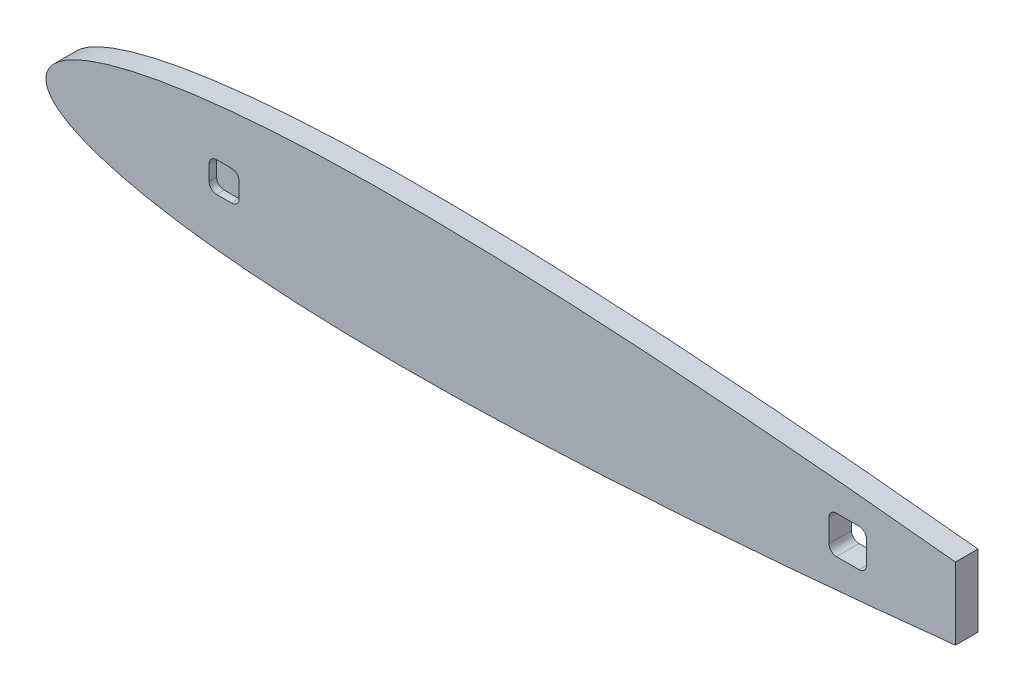
ISO-10303-21;
HEADER;
FILE_DESCRIPTION(('STEP AP214'),'2;1');
FILE_NAME('part.step','',(''),(''),'','','');
FILE_SCHEMA(('AUTOMOTIVE_DESIGN { 1 0 10303 214 1 1 1 1 }'));
ENDSEC;
DATA;
#1=APPLICATION_CONTEXT('core data for automotive mechanical design processes');
#2=APPLICATION_PROTOCOL_DEFINITION('international standard','automotive_design',2000,#1);
#3=PRODUCT_CONTEXT('',#1,'mechanical');
#4=PRODUCT('Part','Part','',(#3));
#5=PRODUCT_RELATED_PRODUCT_CATEGORY('part','',(#4));
#6=PRODUCT_DEFINITION_FORMATION('','',#4);
#7=PRODUCT_DEFINITION_CONTEXT('part definition',#1,'design');
#8=PRODUCT_DEFINITION('design','',#6,#7);
#9=PRODUCT_DEFINITION_SHAPE('','',#8);
#10=(LENGTH_UNIT() NAMED_UNIT(*) SI_UNIT(.MILLI.,.METRE.));
#11=(NAMED_UNIT(*) PLANE_ANGLE_UNIT() SI_UNIT($,.RADIAN.));
#12=(NAMED_UNIT(*) SI_UNIT($,.STERADIAN.) SOLID_ANGLE_UNIT());
#13=UNCERTAINTY_MEASURE_WITH_UNIT(LENGTH_MEASURE(1.E-05),#10,'distance_accuracy_value','');
#14=(GEOMETRIC_REPRESENTATION_CONTEXT(3) GLOBAL_UNCERTAINTY_ASSIGNED_CONTEXT((#13)) GLOBAL_UNIT_ASSIGNED_CONTEXT((#10,
#11,#12)) REPRESENTATION_CONTEXT('',''));
#15=CARTESIAN_POINT('',(0.,0.,0.));
#16=DIRECTION('',(0.,0.,1.));
#17=DIRECTION('',(1.,0.,0.));
#18=AXIS2_PLACEMENT_3D('',#15,#16,#17);
#19=CARTESIAN_POINT('',(241.999999999784,3.15208797082437E-12,6.));
#20=DIRECTION('',(1.,0.,0.));
#21=DIRECTION('',(0.,1.,0.));
#22=AXIS2_PLACEMENT_3D('',#19,#20,#21);
#23=PLANE('',#22);
#24=DIRECTION('',(0.,-1.,0.));
#25=VECTOR('',#24,1.);
#26=CARTESIAN_POINT('',(241.999999999784,3.15208797082437E-12,0.));
#27=LINE('',#26,#25);
#28=CARTESIAN_POINT('',(241.999999999784,9.58914285551744,0.));
#29=VERTEX_POINT('',#28);
#30=CARTESIAN_POINT('',(241.999999999784,-9.58914285551742,0.));
#31=VERTEX_POINT('',#30);
#32=EDGE_CURVE('E158',#29,#31,#27,.T.);
#33=ORIENTED_EDGE('',*,*,#32,.F.);
#34=DIRECTION('',(0.,0.,-1.));
#35=VECTOR('',#34,1.);
#36=CARTESIAN_POINT('',(241.999999999784,9.58914285551744,6.));
#37=LINE('',#36,#35);
#38=CARTESIAN_POINT('',(241.999999999784,9.58914285551744,6.));
#39=VERTEX_POINT('',#38);
#40=EDGE_CURVE('E11',#39,#29,#37,.T.);
#41=ORIENTED_EDGE('',*,*,#40,.F.);
#42=DIRECTION('',(0.,-1.,0.));
#43=VECTOR('',#42,1.);
#44=CARTESIAN_POINT('',(241.999999999784,3.15208797082437E-12,6.));
#45=LINE('',#44,#43);
#46=CARTESIAN_POINT('',(241.999999999784,-9.58914285551742,6.));
#47=VERTEX_POINT('',#46);
#48=EDGE_CURVE('E142',#39,#47,#45,.T.);
#49=ORIENTED_EDGE('',*,*,#48,.T.);
#50=DIRECTION('',(0.,0.,-1.));
#51=VECTOR('',#50,1.);
#52=CARTESIAN_POINT('',(241.999999999784,-9.58914285551742,6.));
#53=LINE('',#52,#51);
#54=EDGE_CURVE('E44',#47,#31,#53,.T.);
#55=ORIENTED_EDGE('',*,*,#54,.T.);
#56=EDGE_LOOP('',(#33,#41,#49,#55));
#57=FACE_BOUND('',#56,.T.);
#58=ADVANCED_FACE('F35',(#57),#23,.T.);
#59=CARTESIAN_POINT('',(208.33333333,0.,6.));
#60=DIRECTION('',(-1.,0.,0.));
#61=DIRECTION('',(0.,0.,1.));
#62=AXIS2_PLACEMENT_3D('',#59,#60,#61);
#63=PLANE('',#62);
#64=DIRECTION('',(0.,1.,0.));
#65=VECTOR('',#64,1.);
#66=CARTESIAN_POINT('',(208.33333333,0.,0.));
#67=LINE('',#66,#65);
#68=CARTESIAN_POINT('',(208.33333333,-3.,0.));
#69=VERTEX_POINT('',#68);
#70=CARTESIAN_POINT('',(208.33333333,2.99999999999997,0.));
#71=VERTEX_POINT('',#70);
#72=EDGE_CURVE('E179',#69,#71,#67,.T.);
#73=ORIENTED_EDGE('',*,*,#72,.T.);
#74=DIRECTION('',(0.,0.,-1.));
#75=VECTOR('',#74,1.);
#76=CARTESIAN_POINT('',(208.33333333,2.99999999999997,6.));
#77=LINE('',#76,#75);
#78=CARTESIAN_POINT('',(208.33333333,2.99999999999997,6.));
#79=VERTEX_POINT('',#78);
#80=EDGE_CURVE('E39',#79,#71,#77,.T.);
#81=ORIENTED_EDGE('',*,*,#80,.F.);
#82=DIRECTION('',(0.,1.,0.));
#83=VECTOR('',#82,1.);
#84=CARTESIAN_POINT('',(208.33333333,0.,6.));
#85=LINE('',#84,#83);
#86=CARTESIAN_POINT('',(208.33333333,-3.,6.));
#87=VERTEX_POINT('',#86);
#88=EDGE_CURVE('E136',#87,#79,#85,.T.);
#89=ORIENTED_EDGE('',*,*,#88,.F.);
#90=DIRECTION('',(0.,0.,-1.));
#91=VECTOR('',#90,1.);
#92=CARTESIAN_POINT('',(208.33333333,-3.,6.));
#93=LINE('',#92,#91);
#94=EDGE_CURVE('E145',#87,#69,#93,.T.);
#95=ORIENTED_EDGE('',*,*,#94,.T.);
#96=EDGE_LOOP('',(#73,#81,#89,#95));
#97=FACE_BOUND('',#96,.T.);
#98=ADVANCED_FACE('F37',(#97),#63,.F.);
#99=CARTESIAN_POINT('',(210.33333333,2.99999999999999,6.));
#100=DIRECTION('',(0.,0.,-1.));
#101=DIRECTION('',(-1.,0.,0.));
#102=AXIS2_PLACEMENT_3D('',#99,#100,#101);
#103=CYLINDRICAL_SURFACE('',#102,2.);
#104=CARTESIAN_POINT('',(210.33333333,2.99999999999999,0.));
#105=DIRECTION('',(0.,0.,1.));
#106=DIRECTION('',(1.,0.,0.));
#107=AXIS2_PLACEMENT_3D('',#104,#105,#106);
#108=CIRCLE('',#107,2.);
#109=CARTESIAN_POINT('',(210.33333333,4.99999999999999,0.));
#110=VERTEX_POINT('',#109);
#111=EDGE_CURVE('E220',#71,#110,#108,.F.);
#112=ORIENTED_EDGE('',*,*,#111,.T.);
#113=DIRECTION('',(0.,0.,-1.));
#114=VECTOR('',#113,1.);
#115=CARTESIAN_POINT('',(210.33333333,4.99999999999999,6.));
#116=LINE('',#115,#114);
#117=CARTESIAN_POINT('',(210.33333333,4.99999999999999,6.));
#118=VERTEX_POINT('',#117);
#119=EDGE_CURVE('E222',#118,#110,#116,.T.);
#120=ORIENTED_EDGE('',*,*,#119,.F.);
#121=CARTESIAN_POINT('',(210.33333333,2.99999999999999,6.));
#122=DIRECTION('',(0.,0.,1.));
#123=DIRECTION('',(1.,0.,0.));
#124=AXIS2_PLACEMENT_3D('',#121,#122,#123);
#125=CIRCLE('',#124,2.);
#126=EDGE_CURVE('E107',#79,#118,#125,.F.);
#127=ORIENTED_EDGE('',*,*,#126,.F.);
#128=ORIENTED_EDGE('',*,*,#80,.T.);
#129=EDGE_LOOP('',(#112,#120,#127,#128));
#130=FACE_BOUND('',#129,.T.);
#131=ADVANCED_FACE('F214',(#130),#103,.F.);
#132=CARTESIAN_POINT('',(0.,4.99999999999999,6.));
#133=DIRECTION('',(0.,1.,0.));
#134=DIRECTION('',(0.,0.,1.));
#135=AXIS2_PLACEMENT_3D('',#132,#133,#134);
#136=PLANE('',#135);
#137=DIRECTION('',(1.,0.,0.));
#138=VECTOR('',#137,1.);
#139=CARTESIAN_POINT('',(0.,4.99999999999999,0.));
#140=LINE('',#139,#138);
#141=CARTESIAN_POINT('',(216.33333333,4.99999999999999,0.));
#142=VERTEX_POINT('',#141);
#143=EDGE_CURVE('E226',#110,#142,#140,.T.);
#144=ORIENTED_EDGE('',*,*,#143,.T.);
#145=DIRECTION('',(0.,0.,-1.));
#146=VECTOR('',#145,1.);
#147=CARTESIAN_POINT('',(216.33333333,4.99999999999999,6.));
#148=LINE('',#147,#146);
#149=CARTESIAN_POINT('',(216.33333333,4.99999999999999,6.));
#150=VERTEX_POINT('',#149);
#151=EDGE_CURVE('E229',#150,#142,#148,.T.);
#152=ORIENTED_EDGE('',*,*,#151,.F.);
#153=DIRECTION('',(1.,0.,0.));
#154=VECTOR('',#153,1.);
#155=CARTESIAN_POINT('',(0.,4.99999999999999,6.));
#156=LINE('',#155,#154);
#157=EDGE_CURVE('E156',#118,#150,#156,.T.);
#158=ORIENTED_EDGE('',*,*,#157,.F.);
#159=ORIENTED_EDGE('',*,*,#119,.T.);
#160=EDGE_LOOP('',(#144,#152,#158,#159));
#161=FACE_BOUND('',#160,.T.);
#162=ADVANCED_FACE('F211',(#161),#136,.F.);
#163=CARTESIAN_POINT('',(216.33333333,2.99999999999999,6.));
#164=DIRECTION('',(0.,0.,-1.));
#165=DIRECTION('',(-1.,0.,0.));
#166=AXIS2_PLACEMENT_3D('',#163,#164,#165);
#167=CYLINDRICAL_SURFACE('',#166,2.);
#168=CARTESIAN_POINT('',(216.33333333,2.99999999999999,0.));
#169=DIRECTION('',(0.,0.,1.));
#170=DIRECTION('',(1.,0.,0.));
#171=AXIS2_PLACEMENT_3D('',#168,#169,#170);
#172=CIRCLE('',#171,2.);
#173=CARTESIAN_POINT('',(218.33333333,2.99999999999997,0.));
#174=VERTEX_POINT('',#173);
#175=EDGE_CURVE('E234',#142,#174,#172,.F.);
#176=ORIENTED_EDGE('',*,*,#175,.T.);
#177=DIRECTION('',(0.,0.,-1.));
#178=VECTOR('',#177,1.);
#179=CARTESIAN_POINT('',(218.33333333,2.99999999999997,6.));
#180=LINE('',#179,#178);
#181=CARTESIAN_POINT('',(218.33333333,2.99999999999997,6.));
#182=VERTEX_POINT('',#181);
#183=EDGE_CURVE('E260',#182,#174,#180,.T.);
#184=ORIENTED_EDGE('',*,*,#183,.F.);
#185=CARTESIAN_POINT('',(216.33333333,2.99999999999999,6.));
#186=DIRECTION('',(0.,0.,1.));
#187=DIRECTION('',(1.,0.,0.));
#188=AXIS2_PLACEMENT_3D('',#185,#186,#187);
#189=CIRCLE('',#188,2.);
#190=EDGE_CURVE('E165',#150,#182,#189,.F.);
#191=ORIENTED_EDGE('',*,*,#190,.F.);
#192=ORIENTED_EDGE('',*,*,#151,.T.);
#193=EDGE_LOOP('',(#176,#184,#191,#192));
#194=FACE_BOUND('',#193,.T.);
#195=ADVANCED_FACE('F207',(#194),#167,.F.);
#196=CARTESIAN_POINT('',(218.33333333,0.,6.));
#197=DIRECTION('',(-1.,0.,0.));
#198=DIRECTION('',(0.,0.,1.));
#199=AXIS2_PLACEMENT_3D('',#196,#197,#198);
#200=PLANE('',#199);
#201=DIRECTION('',(0.,1.,0.));
#202=VECTOR('',#201,1.);
#203=CARTESIAN_POINT('',(218.33333333,0.,0.));
#204=LINE('',#203,#202);
#205=CARTESIAN_POINT('',(218.33333333,-3.,0.));
#206=VERTEX_POINT('',#205);
#207=EDGE_CURVE('E236',#206,#174,#204,.T.);
#208=ORIENTED_EDGE('',*,*,#207,.F.);
#209=DIRECTION('',(0.,0.,-1.));
#210=VECTOR('',#209,1.);
#211=CARTESIAN_POINT('',(218.33333333,-3.,6.));
#212=LINE('',#211,#210);
#213=CARTESIAN_POINT('',(218.33333333,-3.,6.));
#214=VERTEX_POINT('',#213);
#215=EDGE_CURVE('E258',#214,#206,#212,.T.);
#216=ORIENTED_EDGE('',*,*,#215,.F.);
#217=DIRECTION('',(0.,1.,0.));
#218=VECTOR('',#217,1.);
#219=CARTESIAN_POINT('',(218.33333333,0.,6.));
#220=LINE('',#219,#218);
#221=EDGE_CURVE('E167',#214,#182,#220,.T.);
#222=ORIENTED_EDGE('',*,*,#221,.T.);
#223=ORIENTED_EDGE('',*,*,#183,.T.);
#224=EDGE_LOOP('',(#208,#216,#222,#223));
#225=FACE_BOUND('',#224,.T.);
#226=ADVANCED_FACE('F203',(#225),#200,.T.);
#227=CARTESIAN_POINT('',(216.33333333,-3.00000000000001,6.));
#228=DIRECTION('',(0.,0.,-1.));
#229=DIRECTION('',(-1.,0.,0.));
#230=AXIS2_PLACEMENT_3D('',#227,#228,#229);
#231=CYLINDRICAL_SURFACE('',#230,2.);
#232=CARTESIAN_POINT('',(216.33333333,-3.00000000000001,0.));
#233=DIRECTION('',(0.,0.,1.));
#234=DIRECTION('',(1.,0.,0.));
#235=AXIS2_PLACEMENT_3D('',#232,#233,#234);
#236=CIRCLE('',#235,2.);
#237=CARTESIAN_POINT('',(216.33333333,-5.00000000000001,0.));
#238=VERTEX_POINT('',#237);
#239=EDGE_CURVE('E240',#238,#206,#236,.T.);
#240=ORIENTED_EDGE('',*,*,#239,.F.);
#241=DIRECTION('',(0.,0.,-1.));
#242=VECTOR('',#241,1.);
#243=CARTESIAN_POINT('',(216.33333333,-5.00000000000001,6.));
#244=LINE('',#243,#242);
#245=CARTESIAN_POINT('',(216.33333333,-5.00000000000001,6.));
#246=VERTEX_POINT('',#245);
#247=EDGE_CURVE('E256',#246,#238,#244,.T.);
#248=ORIENTED_EDGE('',*,*,#247,.F.);
#249=CARTESIAN_POINT('',(216.33333333,-3.00000000000001,6.));
#250=DIRECTION('',(0.,0.,1.));
#251=DIRECTION('',(1.,0.,0.));
#252=AXIS2_PLACEMENT_3D('',#249,#250,#251);
#253=CIRCLE('',#252,2.);
#254=EDGE_CURVE('E170',#246,#214,#253,.T.);
#255=ORIENTED_EDGE('',*,*,#254,.T.);
#256=ORIENTED_EDGE('',*,*,#215,.T.);
#257=EDGE_LOOP('',(#240,#248,#255,#256));
#258=FACE_BOUND('',#257,.T.);
#259=ADVANCED_FACE('F199',(#258),#231,.F.);
#260=CARTESIAN_POINT('',(0.,-5.00000000000007,6.));
#261=DIRECTION('',(0.,1.,0.));
#262=DIRECTION('',(-1.,0.,0.));
#263=AXIS2_PLACEMENT_3D('',#260,#261,#262);
#264=PLANE('',#263);
#265=DIRECTION('',(1.,0.,0.));
#266=VECTOR('',#265,1.);
#267=CARTESIAN_POINT('',(0.,-5.00000000000007,0.));
#268=LINE('',#267,#266);
#269=CARTESIAN_POINT('',(210.33333333,-5.00000000000001,0.));
#270=VERTEX_POINT('',#269);
#271=EDGE_CURVE('E243',#270,#238,#268,.T.);
#272=ORIENTED_EDGE('',*,*,#271,.F.);
#273=DIRECTION('',(0.,0.,-1.));
#274=VECTOR('',#273,1.);
#275=CARTESIAN_POINT('',(210.33333333,-5.00000000000001,6.));
#276=LINE('',#275,#274);
#277=CARTESIAN_POINT('',(210.33333333,-5.00000000000001,6.));
#278=VERTEX_POINT('',#277);
#279=EDGE_CURVE('E152',#278,#270,#276,.T.);
#280=ORIENTED_EDGE('',*,*,#279,.F.);
#281=DIRECTION('',(1.,0.,0.));
#282=VECTOR('',#281,1.);
#283=CARTESIAN_POINT('',(0.,-5.00000000000007,6.));
#284=LINE('',#283,#282);
#285=EDGE_CURVE('E140',#278,#246,#284,.T.);
#286=ORIENTED_EDGE('',*,*,#285,.T.);
#287=ORIENTED_EDGE('',*,*,#247,.T.);
#288=EDGE_LOOP('',(#272,#280,#286,#287));
#289=FACE_BOUND('',#288,.T.);
#290=ADVANCED_FACE('F196',(#289),#264,.T.);
#291=CARTESIAN_POINT('',(210.33333333,-3.00000000000001,6.));
#292=DIRECTION('',(0.,0.,-1.));
#293=DIRECTION('',(-1.,0.,0.));
#294=AXIS2_PLACEMENT_3D('',#291,#292,#293);
#295=CYLINDRICAL_SURFACE('',#294,2.);
#296=CARTESIAN_POINT('',(210.33333333,-3.00000000000001,0.));
#297=DIRECTION('',(0.,0.,1.));
#298=DIRECTION('',(1.,0.,0.));
#299=AXIS2_PLACEMENT_3D('',#296,#297,#298);
#300=CIRCLE('',#299,2.);
#301=EDGE_CURVE('E148',#270,#69,#300,.F.);
#302=ORIENTED_EDGE('',*,*,#301,.T.);
#303=ORIENTED_EDGE('',*,*,#94,.F.);
#304=CARTESIAN_POINT('',(210.33333333,-3.00000000000001,6.));
#305=DIRECTION('',(0.,0.,1.));
#306=DIRECTION('',(1.,0.,0.));
#307=AXIS2_PLACEMENT_3D('',#304,#305,#306);
#308=CIRCLE('',#307,2.);
#309=EDGE_CURVE('E132',#278,#87,#308,.F.);
#310=ORIENTED_EDGE('',*,*,#309,.F.);
#311=ORIENTED_EDGE('',*,*,#279,.T.);
#312=EDGE_LOOP('',(#302,#303,#310,#311));
#313=FACE_BOUND('',#312,.T.);
#314=ADVANCED_FACE('F146',(#313),#295,.F.);
#315=CARTESIAN_POINT('',(320.,0.,6.));
#316=CARTESIAN_POINT('',(320.,0.133182649318628,6.));
#317=CARTESIAN_POINT('',(318.01697306499,0.275032740140815,6.));
#318=CARTESIAN_POINT('',(316.84880777505,0.442942657497622,6.));
#319=CARTESIAN_POINT('',(316.288677494677,0.520522961280027,6.));
#320=CARTESIAN_POINT('',(315.368776806968,0.649539067766187,6.));
#321=CARTESIAN_POINT('',(314.078252578898,0.829011487731861,6.));
#322=CARTESIAN_POINT('',(312.426372480827,1.0568918178898,6.));
#323=CARTESIAN_POINT('',(310.414577435593,1.3334634585745,6.));
#324=CARTESIAN_POINT('',(308.048312151593,1.65573508706709,6.));
#325=CARTESIAN_POINT('',(305.332843608494,2.02161935327418,6.));
#326=CARTESIAN_POINT('',(302.274717108569,2.4295516772933,6.));
#327=CARTESIAN_POINT('',(298.881003271153,2.87660334035858,6.));
#328=CARTESIAN_POINT('',(295.159621346172,3.36067437244164,6.));
#329=CARTESIAN_POINT('',(291.119182018795,3.87787921243335,6.));
#330=CARTESIAN_POINT('',(286.769188136269,4.42690993799677,6.));
#331=CARTESIAN_POINT('',(282.119766746158,5.00392524737834,6.));
#332=CARTESIAN_POINT('',(277.181819153514,5.60594088514599,6.));
#333=CARTESIAN_POINT('',(271.966914324913,6.23026953192193,6.));
#334=CARTESIAN_POINT('',(266.487196766004,6.87364889330169,6.));
#335=CARTESIAN_POINT('',(260.755263255031,7.53222489809375,6.));
#336=CARTESIAN_POINT('',(254.784827224022,8.20431558345287,6.));
#337=CARTESIAN_POINT('',(248.589645414032,8.88509973786435,6.));
#338=CARTESIAN_POINT('',(242.184383354752,9.57274889131838,6.));
#339=CARTESIAN_POINT('',(235.583749906996,10.2623489727156,6.));
#340=CARTESIAN_POINT('',(228.803304099926,10.9526220945279,6.));
#341=CARTESIAN_POINT('',(221.858798662995,11.6382454595536,6.));
#342=CARTESIAN_POINT('',(214.766562031293,12.3170657165461,6.));
#343=CARTESIAN_POINT('',(207.543063708747,12.9843681511121,6.));
#344=CARTESIAN_POINT('',(200.205154302217,13.6379711068426,6.));
#345=CARTESIAN_POINT('',(192.770016736436,14.2724713508617,6.));
#346=CARTESIAN_POINT('',(185.254977834257,14.8850307803602,6.));
#347=CARTESIAN_POINT('',(177.677684333596,15.4717375836215,6.));
#348=CARTESIAN_POINT('',(170.05573664343,16.0278818858612,6.));
#349=CARTESIAN_POINT('',(162.407046659832,16.5499756368838,6.));
#350=CARTESIAN_POINT('',(154.749469181883,17.0338484421294,6.));
#351=CARTESIAN_POINT('',(147.100729109035,17.4748272280845,6.));
#352=CARTESIAN_POINT('',(139.478832182892,17.8694246815775,6.));
#353=CARTESIAN_POINT('',(131.901405659183,18.2133329588072,6.));
#354=CARTESIAN_POINT('',(124.386208897438,18.5027209341571,6.));
#355=CARTESIAN_POINT('',(116.950906263245,18.7343758853287,6.));
#356=CARTESIAN_POINT('',(109.612808745574,18.9041771614591,6.));
#357=CARTESIAN_POINT('',(102.389047685516,19.0091313123432,6.));
#358=CARTESIAN_POINT('',(95.2963186994254,19.0462884489526,6.));
#359=CARTESIAN_POINT('',(88.3513262525057,19.0134406505077,6.));
#360=CARTESIAN_POINT('',(81.5703242703388,18.9091110236186,6.));
#361=CARTESIAN_POINT('',(74.9692028009651,18.7301466740328,6.));
#362=CARTESIAN_POINT('',(68.5632318987944,18.4773395094877,6.));
#363=CARTESIAN_POINT('',(62.367359063551,18.1488730858895,6.));
#364=CARTESIAN_POINT('',(56.3960090699386,17.7456680310888,6.));
#365=CARTESIAN_POINT('',(50.663243103576,17.2678084133444,6.));
#366=CARTESIAN_POINT('',(45.1823894896725,16.7161627700282,6.));
#367=CARTESIAN_POINT('',(39.9661831811646,16.0928237112832,6.));
#368=CARTESIAN_POINT('',(35.026649567062,15.4003249931805,6.));
#369=CARTESIAN_POINT('',(30.3754250195268,14.6399574369544,6.));
#370=CARTESIAN_POINT('',(26.0231692643504,13.8155212644844,6.));
#371=CARTESIAN_POINT('',(21.979898941236,12.9301164937415,6.));
#372=CARTESIAN_POINT('',(18.2550635132256,11.9867445190098,6.));
#373=CARTESIAN_POINT('',(14.8568936967311,10.9896315191996,6.));
#374=CARTESIAN_POINT('',(11.7928824502303,9.94208890316081,6.));
#375=CARTESIAN_POINT('',(9.06956395155251,8.84773463333656,6.));
#376=CARTESIAN_POINT('',(6.69232912880828,7.70972573239625,6.));
#377=CARTESIAN_POINT('',(4.66570692724373,6.53043146843351,6.));
#378=CARTESIAN_POINT('',(2.99205725999799,5.31185098515726,6.));
#379=CARTESIAN_POINT('',(1.67461407725263,4.05197977961131,6.));
#380=CARTESIAN_POINT('',(0.716554426684253,2.74724884992603,6.));
#381=CARTESIAN_POINT('',(0.13079524504182,1.39128082431738,6.));
#382=CARTESIAN_POINT('',(-0.0637550791329045,0.,6.));
#383=CARTESIAN_POINT('',(0.130795245041814,-1.39128082431734,6.));
#384=CARTESIAN_POINT('',(0.716554426684266,-2.74724884992606,6.));
#385=CARTESIAN_POINT('',(1.67461407725261,-4.05197977961128,6.));
#386=CARTESIAN_POINT('',(2.99205725999799,-5.31185098515726,6.));
#387=CARTESIAN_POINT('',(4.66570692724372,-6.53043146843351,6.));
#388=CARTESIAN_POINT('',(6.69232912880828,-7.70972573239625,6.));
#389=CARTESIAN_POINT('',(9.06956395155249,-8.84773463333656,6.));
#390=CARTESIAN_POINT('',(11.7928824502304,-9.94208890316083,6.));
#391=CARTESIAN_POINT('',(14.8568936967311,-10.9896315191996,6.));
#392=CARTESIAN_POINT('',(18.2550635132256,-11.9867445190098,6.));
#393=CARTESIAN_POINT('',(21.979898941236,-12.9301164937415,6.));
#394=CARTESIAN_POINT('',(26.0231692643504,-13.8155212644844,6.));
#395=CARTESIAN_POINT('',(30.3754250195269,-14.6399574369544,6.));
#396=CARTESIAN_POINT('',(35.026649567062,-15.4003249931805,6.));
#397=CARTESIAN_POINT('',(39.9661831811645,-16.0928237112832,6.));
#398=CARTESIAN_POINT('',(45.1823894896726,-16.7161627700282,6.));
#399=CARTESIAN_POINT('',(50.663243103576,-17.2678084133444,6.));
#400=CARTESIAN_POINT('',(56.3960090699385,-17.7456680310888,6.));
#401=CARTESIAN_POINT('',(62.367359063551,-18.1488730858895,6.));
#402=CARTESIAN_POINT('',(68.5632318987944,-18.4773395094877,6.));
#403=CARTESIAN_POINT('',(74.9692028009651,-18.7301466740328,6.));
#404=CARTESIAN_POINT('',(81.5703242703387,-18.9091110236186,6.));
#405=CARTESIAN_POINT('',(88.3513262525057,-19.0134406505077,6.));
#406=CARTESIAN_POINT('',(95.2963186994254,-19.0462884489526,6.));
#407=CARTESIAN_POINT('',(102.389047685516,-19.0091313123432,6.));
#408=CARTESIAN_POINT('',(109.612808745574,-18.9041771614591,6.));
#409=CARTESIAN_POINT('',(116.950906263245,-18.7343758853287,6.));
#410=CARTESIAN_POINT('',(124.386208897438,-18.5027209341571,6.));
#411=CARTESIAN_POINT('',(131.901405659183,-18.2133329588072,6.));
#412=CARTESIAN_POINT('',(139.478832182892,-17.8694246815775,6.));
#413=CARTESIAN_POINT('',(147.100729109035,-17.4748272280845,6.));
#414=CARTESIAN_POINT('',(154.749469181883,-17.0338484421294,6.));
#415=CARTESIAN_POINT('',(162.407046659832,-16.5499756368838,6.));
#416=CARTESIAN_POINT('',(170.05573664343,-16.0278818858612,6.));
#417=CARTESIAN_POINT('',(177.677684333596,-15.4717375836215,6.));
#418=CARTESIAN_POINT('',(185.254977834257,-14.8850307803602,6.));
#419=CARTESIAN_POINT('',(192.770016736436,-14.2724713508617,6.));
#420=CARTESIAN_POINT('',(200.205154302217,-13.6379711068426,6.));
#421=CARTESIAN_POINT('',(207.543063708747,-12.9843681511121,6.));
#422=CARTESIAN_POINT('',(214.766562031293,-12.3170657165461,6.));
#423=CARTESIAN_POINT('',(221.858798662995,-11.6382454595537,6.));
#424=CARTESIAN_POINT('',(228.803304099926,-10.9526220945279,6.));
#425=CARTESIAN_POINT('',(235.583749906996,-10.2623489727156,6.));
#426=CARTESIAN_POINT('',(242.184383354752,-9.57274889131837,6.));
#427=CARTESIAN_POINT('',(248.589645414032,-8.88509973786436,6.));
#428=CARTESIAN_POINT('',(254.784827224022,-8.20431558345288,6.));
#429=CARTESIAN_POINT('',(260.755263255031,-7.53222489809375,6.));
#430=CARTESIAN_POINT('',(266.487196766004,-6.8736488933017,6.));
#431=CARTESIAN_POINT('',(271.966914324913,-6.23026953192191,6.));
#432=CARTESIAN_POINT('',(277.181819153514,-5.605940885146,6.));
#433=CARTESIAN_POINT('',(282.119766746158,-5.00392524737834,6.));
#434=CARTESIAN_POINT('',(286.769188136269,-4.42690993799678,6.));
#435=CARTESIAN_POINT('',(291.119182018795,-3.87787921243335,6.));
#436=CARTESIAN_POINT('',(295.159621346171,-3.36067437244164,6.));
#437=CARTESIAN_POINT('',(298.881003271153,-2.87660334035857,6.));
#438=CARTESIAN_POINT('',(302.274717108569,-2.42955167729331,6.));
#439=CARTESIAN_POINT('',(305.332843608494,-2.02161935327417,6.));
#440=CARTESIAN_POINT('',(308.048312151593,-1.65573508706709,6.));
#441=CARTESIAN_POINT('',(310.414577435593,-1.33346345857449,6.));
#442=CARTESIAN_POINT('',(312.426372480827,-1.0568918178898,6.));
#443=CARTESIAN_POINT('',(314.078252578897,-0.829011487731875,6.));
#444=CARTESIAN_POINT('',(315.368776806968,-0.649539067766185,6.));
#445=CARTESIAN_POINT('',(316.288677494677,-0.520522961280029,6.));
#446=CARTESIAN_POINT('',(316.84880777505,-0.442942657497619,6.));
#447=CARTESIAN_POINT('',(318.016973064991,-0.275032740140822,6.));
#448=CARTESIAN_POINT('',(320.,-0.133182649318626,6.));
#449=CARTESIAN_POINT('',(320.,0.,6.));
#450=B_SPLINE_CURVE_WITH_KNOTS('',3,(#315,#316,#317,#318,#319,#320,#321,#322,#323,#324,#325,
#326,#327,#328,#329,#330,#331,#332,#333,#334,#335,#336,#337,#338,#339,#340,#341,#342,#343,#344,
#345,#346,#347,#348,#349,#350,#351,#352,#353,#354,#355,#356,#357,#358,#359,#360,#361,#362,#363,
#364,#365,#366,#367,#368,#369,#370,#371,#372,#373,#374,#375,#376,#377,#378,#379,#380,#381,#382,
#383,#384,#385,#386,#387,#388,#389,#390,#391,#392,#393,#394,#395,#396,#397,#398,#399,#400,#401,
#402,#403,#404,#405,#406,#407,#408,#409,#410,#411,#412,#413,#414,#415,#416,#417,#418,#419,#420,
#421,#422,#423,#424,#425,#426,#427,#428,#429,#430,#431,#432,#433,#434,#435,#436,#437,#438,#439,
#440,#441,#442,#443,#444,#445,#446,#447,#448,#449),.UNSPECIFIED.,.T.,.F.,(4,1,1,1,1,1,1,1,1,1,1,
1,1,1,1,1,1,1,1,1,1,1,1,1,1,1,1,1,1,1,1,1,1,1,1,1,1,1,1,1,1,1,1,1,1,1,1,1,1,1,1,1,1,1,1,1,1,1,1,
1,1,1,1,1,1,1,1,1,1,1,1,1,1,1,1,1,1,1,1,1,1,1,1,1,1,1,1,1,1,1,1,1,1,1,1,1,1,1,1,1,1,1,1,1,1,1,1,
1,1,1,1,1,1,1,1,1,1,1,1,1,1,1,1,1,1,1,1,1,1,1,1,1,4),(0.,0.00440467877607681,
0.00469133244927638,0.00555026340377994,0.0069799599667822,0.00897636955575684,
0.0115348259985445,0.0146494199721783,0.0183124681670786,0.0225153297842018,0.0272475071229079,
0.032497896913234,0.0382539577933213,0.0445020673455946,0.0512268693130687,0.0584133136949564,
0.0660434673993257,0.0740989841825477,0.0825619521790067,0.0914115186690312,0.100627009155939,
0.110186574624162,0.120067574883575,0.130246743106217,0.140700546590037,0.151404252344224,
0.162331841996811,0.173458675482544,0.184758289776345,0.196204075900887,0.207768617623901,
0.219425944892053,0.231147635002543,0.242906359383194,0.254675296448483,0.266426209682853,
0.278132454927868,0.289766476772588,0.301301813973083,0.312711645899057,0.323969258972261,
0.335050049610105,0.345928598532507,0.356580621261844,0.366981996115219,0.377109775978597,
0.386942118760865,0.39645790503277,0.405636644865947,0.414459070100601,0.422906620419414,
0.430962851260498,0.438611617879562,0.445838274988959,0.452630376833404,0.458976172587894,
0.464866300151259,0.470293867959941,0.475254828846552,0.479749124231809,0.483781005917311,
0.48736257976456,0.49051563172602,0.493278565848754,0.495712194393957,0.497909944007274,0.5,
0.502090055992727,0.504287805606043,0.506721434151247,0.509484368273981,0.512637420235441,
0.516218994082689,0.520250875768192,0.524745171153449,0.529706132040059,0.535133699848742,
0.541023827412107,0.547369623166597,0.554161725011042,0.561388382120439,0.569037148739503,
0.577093379580587,0.5855409298994,0.594363355134054,0.60354209496723,0.613057881239136,
0.622890224021404,0.633018003884782,0.643419378738157,0.654071401467494,0.664949950389895,
0.67603074102774,0.687288354100943,0.698698186026918,0.710233523227413,0.721867545072133,
0.733573790317148,0.745324703551517,0.757093640616807,0.768852364997457,0.780574055107948,
0.792231382376099,0.803795924099114,0.815241710223656,0.826541324517457,0.83766815800319,
0.848595747655777,0.859299453409963,0.869753256893783,0.879932425116426,0.889813425375838,
0.899372990844062,0.908588481330969,0.917438047820994,0.925901015817453,0.933956532600675,
0.941586686305044,0.948773130686932,0.955497932654406,0.961746042206679,0.967502103086766,
0.972752492877092,0.977484670215798,0.981687531832922,0.985350580027822,0.988465174001456,
0.991023630444243,0.993020040033218,0.99444973659622,0.995308667550724,0.995595321223923,1.),.UNSPECIFIED.);
#451=DIRECTION('',(0.,0.,-1.));
#452=VECTOR('',#451,1.);
#453=SURFACE_OF_LINEAR_EXTRUSION('',#450,#452);
#454=CARTESIAN_POINT('',(320.,0.,0.));
#455=CARTESIAN_POINT('',(320.,0.133182649318628,0.));
#456=CARTESIAN_POINT('',(318.01697306499,0.275032740140815,0.));
#457=CARTESIAN_POINT('',(316.84880777505,0.442942657497622,0.));
#458=CARTESIAN_POINT('',(316.288677494677,0.520522961280027,0.));
#459=CARTESIAN_POINT('',(315.368776806968,0.649539067766187,0.));
#460=CARTESIAN_POINT('',(314.078252578898,0.829011487731861,0.));
#461=CARTESIAN_POINT('',(312.426372480827,1.0568918178898,0.));
#462=CARTESIAN_POINT('',(310.414577435593,1.3334634585745,0.));
#463=CARTESIAN_POINT('',(308.048312151593,1.65573508706709,0.));
#464=CARTESIAN_POINT('',(305.332843608494,2.02161935327418,0.));
#465=CARTESIAN_POINT('',(302.274717108569,2.4295516772933,0.));
#466=CARTESIAN_POINT('',(298.881003271153,2.87660334035858,0.));
#467=CARTESIAN_POINT('',(295.159621346172,3.36067437244164,0.));
#468=CARTESIAN_POINT('',(291.119182018795,3.87787921243335,0.));
#469=CARTESIAN_POINT('',(286.769188136269,4.42690993799677,0.));
#470=CARTESIAN_POINT('',(282.119766746158,5.00392524737834,0.));
#471=CARTESIAN_POINT('',(277.181819153514,5.60594088514599,0.));
#472=CARTESIAN_POINT('',(271.966914324913,6.23026953192193,0.));
#473=CARTESIAN_POINT('',(266.487196766004,6.87364889330169,0.));
#474=CARTESIAN_POINT('',(260.755263255031,7.53222489809375,0.));
#475=CARTESIAN_POINT('',(254.784827224022,8.20431558345287,0.));
#476=CARTESIAN_POINT('',(248.589645414032,8.88509973786435,0.));
#477=CARTESIAN_POINT('',(242.184383354752,9.57274889131838,0.));
#478=CARTESIAN_POINT('',(235.583749906996,10.2623489727156,0.));
#479=CARTESIAN_POINT('',(228.803304099926,10.9526220945279,0.));
#480=CARTESIAN_POINT('',(221.858798662995,11.6382454595536,0.));
#481=CARTESIAN_POINT('',(214.766562031293,12.3170657165461,0.));
#482=CARTESIAN_POINT('',(207.543063708747,12.9843681511121,0.));
#483=CARTESIAN_POINT('',(200.205154302217,13.6379711068426,0.));
#484=CARTESIAN_POINT('',(192.770016736436,14.2724713508617,0.));
#485=CARTESIAN_POINT('',(185.254977834257,14.8850307803602,0.));
#486=CARTESIAN_POINT('',(177.677684333596,15.4717375836215,0.));
#487=CARTESIAN_POINT('',(170.05573664343,16.0278818858612,0.));
#488=CARTESIAN_POINT('',(162.407046659832,16.5499756368838,0.));
#489=CARTESIAN_POINT('',(154.749469181883,17.0338484421294,0.));
#490=CARTESIAN_POINT('',(147.100729109035,17.4748272280845,0.));
#491=CARTESIAN_POINT('',(139.478832182892,17.8694246815775,0.));
#492=CARTESIAN_POINT('',(131.901405659183,18.2133329588072,0.));
#493=CARTESIAN_POINT('',(124.386208897438,18.5027209341571,0.));
#494=CARTESIAN_POINT('',(116.950906263245,18.7343758853287,0.));
#495=CARTESIAN_POINT('',(109.612808745574,18.9041771614591,0.));
#496=CARTESIAN_POINT('',(102.389047685516,19.0091313123432,0.));
#497=CARTESIAN_POINT('',(95.2963186994254,19.0462884489526,0.));
#498=CARTESIAN_POINT('',(88.3513262525057,19.0134406505077,0.));
#499=CARTESIAN_POINT('',(81.5703242703388,18.9091110236186,0.));
#500=CARTESIAN_POINT('',(74.9692028009651,18.7301466740328,0.));
#501=CARTESIAN_POINT('',(68.5632318987944,18.4773395094877,0.));
#502=CARTESIAN_POINT('',(62.367359063551,18.1488730858895,0.));
#503=CARTESIAN_POINT('',(56.3960090699386,17.7456680310888,0.));
#504=CARTESIAN_POINT('',(50.663243103576,17.2678084133444,0.));
#505=CARTESIAN_POINT('',(45.1823894896725,16.7161627700282,0.));
#506=CARTESIAN_POINT('',(39.9661831811646,16.0928237112832,0.));
#507=CARTESIAN_POINT('',(35.026649567062,15.4003249931805,0.));
#508=CARTESIAN_POINT('',(30.3754250195268,14.6399574369544,0.));
#509=CARTESIAN_POINT('',(26.0231692643504,13.8155212644844,0.));
#510=CARTESIAN_POINT('',(21.979898941236,12.9301164937415,0.));
#511=CARTESIAN_POINT('',(18.2550635132256,11.9867445190098,0.));
#512=CARTESIAN_POINT('',(14.8568936967311,10.9896315191996,0.));
#513=CARTESIAN_POINT('',(11.7928824502303,9.94208890316081,0.));
#514=CARTESIAN_POINT('',(9.06956395155251,8.84773463333656,0.));
#515=CARTESIAN_POINT('',(6.69232912880828,7.70972573239625,0.));
#516=CARTESIAN_POINT('',(4.66570692724373,6.53043146843351,0.));
#517=CARTESIAN_POINT('',(2.99205725999799,5.31185098515726,0.));
#518=CARTESIAN_POINT('',(1.67461407725263,4.05197977961131,0.));
#519=CARTESIAN_POINT('',(0.716554426684253,2.74724884992603,0.));
#520=CARTESIAN_POINT('',(0.13079524504182,1.39128082431738,0.));
#521=CARTESIAN_POINT('',(-0.0637550791329045,0.,0.));
#522=CARTESIAN_POINT('',(0.130795245041814,-1.39128082431734,0.));
#523=CARTESIAN_POINT('',(0.716554426684266,-2.74724884992606,0.));
#524=CARTESIAN_POINT('',(1.67461407725261,-4.05197977961128,0.));
#525=CARTESIAN_POINT('',(2.99205725999799,-5.31185098515726,0.));
#526=CARTESIAN_POINT('',(4.66570692724372,-6.53043146843351,0.));
#527=CARTESIAN_POINT('',(6.69232912880828,-7.70972573239625,0.));
#528=CARTESIAN_POINT('',(9.06956395155249,-8.84773463333656,0.));
#529=CARTESIAN_POINT('',(11.7928824502304,-9.94208890316083,0.));
#530=CARTESIAN_POINT('',(14.8568936967311,-10.9896315191996,0.));
#531=CARTESIAN_POINT('',(18.2550635132256,-11.9867445190098,0.));
#532=CARTESIAN_POINT('',(21.979898941236,-12.9301164937415,0.));
#533=CARTESIAN_POINT('',(26.0231692643504,-13.8155212644844,0.));
#534=CARTESIAN_POINT('',(30.3754250195269,-14.6399574369544,0.));
#535=CARTESIAN_POINT('',(35.026649567062,-15.4003249931805,0.));
#536=CARTESIAN_POINT('',(39.9661831811645,-16.0928237112832,0.));
#537=CARTESIAN_POINT('',(45.1823894896726,-16.7161627700282,0.));
#538=CARTESIAN_POINT('',(50.663243103576,-17.2678084133444,0.));
#539=CARTESIAN_POINT('',(56.3960090699385,-17.7456680310888,0.));
#540=CARTESIAN_POINT('',(62.367359063551,-18.1488730858895,0.));
#541=CARTESIAN_POINT('',(68.5632318987944,-18.4773395094877,0.));
#542=CARTESIAN_POINT('',(74.9692028009651,-18.7301466740328,0.));
#543=CARTESIAN_POINT('',(81.5703242703387,-18.9091110236186,0.));
#544=CARTESIAN_POINT('',(88.3513262525057,-19.0134406505077,0.));
#545=CARTESIAN_POINT('',(95.2963186994254,-19.0462884489526,0.));
#546=CARTESIAN_POINT('',(102.389047685516,-19.0091313123432,0.));
#547=CARTESIAN_POINT('',(109.612808745574,-18.9041771614591,0.));
#548=CARTESIAN_POINT('',(116.950906263245,-18.7343758853287,0.));
#549=CARTESIAN_POINT('',(124.386208897438,-18.5027209341571,0.));
#550=CARTESIAN_POINT('',(131.901405659183,-18.2133329588072,0.));
#551=CARTESIAN_POINT('',(139.478832182892,-17.8694246815775,0.));
#552=CARTESIAN_POINT('',(147.100729109035,-17.4748272280845,0.));
#553=CARTESIAN_POINT('',(154.749469181883,-17.0338484421294,0.));
#554=CARTESIAN_POINT('',(162.407046659832,-16.5499756368838,0.));
#555=CARTESIAN_POINT('',(170.05573664343,-16.0278818858612,0.));
#556=CARTESIAN_POINT('',(177.677684333596,-15.4717375836215,0.));
#557=CARTESIAN_POINT('',(185.254977834257,-14.8850307803602,0.));
#558=CARTESIAN_POINT('',(192.770016736436,-14.2724713508617,0.));
#559=CARTESIAN_POINT('',(200.205154302217,-13.6379711068426,0.));
#560=CARTESIAN_POINT('',(207.543063708747,-12.9843681511121,0.));
#561=CARTESIAN_POINT('',(214.766562031293,-12.3170657165461,0.));
#562=CARTESIAN_POINT('',(221.858798662995,-11.6382454595537,0.));
#563=CARTESIAN_POINT('',(228.803304099926,-10.9526220945279,0.));
#564=CARTESIAN_POINT('',(235.583749906996,-10.2623489727156,0.));
#565=CARTESIAN_POINT('',(242.184383354752,-9.57274889131837,0.));
#566=CARTESIAN_POINT('',(248.589645414032,-8.88509973786436,0.));
#567=CARTESIAN_POINT('',(254.784827224022,-8.20431558345288,0.));
#568=CARTESIAN_POINT('',(260.755263255031,-7.53222489809375,0.));
#569=CARTESIAN_POINT('',(266.487196766004,-6.8736488933017,0.));
#570=CARTESIAN_POINT('',(271.966914324913,-6.23026953192191,0.));
#571=CARTESIAN_POINT('',(277.181819153514,-5.605940885146,0.));
#572=CARTESIAN_POINT('',(282.119766746158,-5.00392524737834,0.));
#573=CARTESIAN_POINT('',(286.769188136269,-4.42690993799678,0.));
#574=CARTESIAN_POINT('',(291.119182018795,-3.87787921243335,0.));
#575=CARTESIAN_POINT('',(295.159621346171,-3.36067437244164,0.));
#576=CARTESIAN_POINT('',(298.881003271153,-2.87660334035857,0.));
#577=CARTESIAN_POINT('',(302.274717108569,-2.42955167729331,0.));
#578=CARTESIAN_POINT('',(305.332843608494,-2.02161935327417,0.));
#579=CARTESIAN_POINT('',(308.048312151593,-1.65573508706709,0.));
#580=CARTESIAN_POINT('',(310.414577435593,-1.33346345857449,0.));
#581=CARTESIAN_POINT('',(312.426372480827,-1.0568918178898,0.));
#582=CARTESIAN_POINT('',(314.078252578897,-0.829011487731875,0.));
#583=CARTESIAN_POINT('',(315.368776806968,-0.649539067766185,0.));
#584=CARTESIAN_POINT('',(316.288677494677,-0.520522961280029,0.));
#585=CARTESIAN_POINT('',(316.84880777505,-0.442942657497619,0.));
#586=CARTESIAN_POINT('',(318.016973064991,-0.275032740140822,0.));
#587=CARTESIAN_POINT('',(320.,-0.133182649318626,0.));
#588=CARTESIAN_POINT('',(320.,0.,0.));
#589=B_SPLINE_CURVE_WITH_KNOTS('',3,(#454,#455,#456,#457,#458,#459,#460,#461,#462,#463,#464,
#465,#466,#467,#468,#469,#470,#471,#472,#473,#474,#475,#476,#477,#478,#479,#480,#481,#482,#483,
#484,#485,#486,#487,#488,#489,#490,#491,#492,#493,#494,#495,#496,#497,#498,#499,#500,#501,#502,
#503,#504,#505,#506,#507,#508,#509,#510,#511,#512,#513,#514,#515,#516,#517,#518,#519,#520,#521,
#522,#523,#524,#525,#526,#527,#528,#529,#530,#531,#532,#533,#534,#535,#536,#537,#538,#539,#540,
#541,#542,#543,#544,#545,#546,#547,#548,#549,#550,#551,#552,#553,#554,#555,#556,#557,#558,#559,
#560,#561,#562,#563,#564,#565,#566,#567,#568,#569,#570,#571,#572,#573,#574,#575,#576,#577,#578,
#579,#580,#581,#582,#583,#584,#585,#586,#587,#588),.UNSPECIFIED.,.T.,.F.,(4,1,1,1,1,1,1,1,1,1,1,
1,1,1,1,1,1,1,1,1,1,1,1,1,1,1,1,1,1,1,1,1,1,1,1,1,1,1,1,1,1,1,1,1,1,1,1,1,1,1,1,1,1,1,1,1,1,1,1,
1,1,1,1,1,1,1,1,1,1,1,1,1,1,1,1,1,1,1,1,1,1,1,1,1,1,1,1,1,1,1,1,1,1,1,1,1,1,1,1,1,1,1,1,1,1,1,1,
1,1,1,1,1,1,1,1,1,1,1,1,1,1,1,1,1,1,1,1,1,1,1,1,1,4),(0.,0.00440467877607681,
0.00469133244927638,0.00555026340377994,0.0069799599667822,0.00897636955575684,
0.0115348259985445,0.0146494199721783,0.0183124681670786,0.0225153297842018,0.0272475071229079,
0.032497896913234,0.0382539577933213,0.0445020673455946,0.0512268693130687,0.0584133136949564,
0.0660434673993257,0.0740989841825477,0.0825619521790067,0.0914115186690312,0.100627009155939,
0.110186574624162,0.120067574883575,0.130246743106217,0.140700546590037,0.151404252344224,
0.162331841996811,0.173458675482544,0.184758289776345,0.196204075900887,0.207768617623901,
0.219425944892053,0.231147635002543,0.242906359383194,0.254675296448483,0.266426209682853,
0.278132454927868,0.289766476772588,0.301301813973083,0.312711645899057,0.323969258972261,
0.335050049610105,0.345928598532507,0.356580621261844,0.366981996115219,0.377109775978597,
0.386942118760865,0.39645790503277,0.405636644865947,0.414459070100601,0.422906620419414,
0.430962851260498,0.438611617879562,0.445838274988959,0.452630376833404,0.458976172587894,
0.464866300151259,0.470293867959941,0.475254828846552,0.479749124231809,0.483781005917311,
0.48736257976456,0.49051563172602,0.493278565848754,0.495712194393957,0.497909944007274,0.5,
0.502090055992727,0.504287805606043,0.506721434151247,0.509484368273981,0.512637420235441,
0.516218994082689,0.520250875768192,0.524745171153449,0.529706132040059,0.535133699848742,
0.541023827412107,0.547369623166597,0.554161725011042,0.561388382120439,0.569037148739503,
0.577093379580587,0.5855409298994,0.594363355134054,0.60354209496723,0.613057881239136,
0.622890224021404,0.633018003884782,0.643419378738157,0.654071401467494,0.664949950389895,
0.67603074102774,0.687288354100943,0.698698186026918,0.710233523227413,0.721867545072133,
0.733573790317148,0.745324703551517,0.757093640616807,0.768852364997457,0.780574055107948,
0.792231382376099,0.803795924099114,0.815241710223656,0.826541324517457,0.83766815800319,
0.848595747655777,0.859299453409963,0.869753256893783,0.879932425116426,0.889813425375838,
0.899372990844062,0.908588481330969,0.917438047820994,0.925901015817453,0.933956532600675,
0.941586686305044,0.948773130686932,0.955497932654406,0.961746042206679,0.967502103086766,
0.972752492877092,0.977484670215798,0.981687531832922,0.985350580027822,0.988465174001456,
0.991023630444243,0.993020040033218,0.99444973659622,0.995308667550724,0.995595321223923,1.),.UNSPECIFIED.);
#590=EDGE_CURVE('E154',#29,#31,#589,.T.);
#591=ORIENTED_EDGE('',*,*,#590,.T.);
#592=ORIENTED_EDGE('',*,*,#54,.F.);
#593=EDGE_CURVE('E60',#39,#47,#450,.T.);
#594=ORIENTED_EDGE('',*,*,#593,.F.);
#595=ORIENTED_EDGE('',*,*,#40,.T.);
#596=EDGE_LOOP('',(#591,#592,#594,#595));
#597=FACE_BOUND('',#596,.T.);
#598=ADVANCED_FACE('F185',(#597),#453,.F.);
#599=CARTESIAN_POINT('',(0.,0.,6.));
#600=DIRECTION('',(0.,0.,1.));
#601=DIRECTION('',(1.,0.,0.));
#602=AXIS2_PLACEMENT_3D('',#599,#600,#601);
#603=PLANE('',#602);
#604=CARTESIAN_POINT('',(45.4,-2.,6.));
#605=DIRECTION('',(0.,0.,1.));
#606=DIRECTION('',(-1.,0.,0.));
#607=AXIS2_PLACEMENT_3D('',#604,#605,#606);
#608=CIRCLE('',#607,2.);
#609=CARTESIAN_POINT('',(43.4,-1.99999999999999,6.));
#610=VERTEX_POINT('',#609);
#611=CARTESIAN_POINT('',(45.4,-4.,6.));
#612=VERTEX_POINT('',#611);
#613=EDGE_CURVE('E52',#610,#612,#608,.T.);
#614=ORIENTED_EDGE('',*,*,#613,.F.);
#615=DIRECTION('',(0.,-1.,0.));
#616=VECTOR('',#615,1.);
#617=CARTESIAN_POINT('',(43.4,-1.99999999999999,6.));
#618=LINE('',#617,#616);
#619=CARTESIAN_POINT('',(43.4,1.99999999999998,6.));
#620=VERTEX_POINT('',#619);
#621=EDGE_CURVE('E278',#620,#610,#618,.T.);
#622=ORIENTED_EDGE('',*,*,#621,.F.);
#623=CARTESIAN_POINT('',(45.4,2.,6.));
#624=DIRECTION('',(0.,0.,1.));
#625=DIRECTION('',(-1.,0.,0.));
#626=AXIS2_PLACEMENT_3D('',#623,#624,#625);
#627=CIRCLE('',#626,2.);
#628=CARTESIAN_POINT('',(45.4,4.,6.));
#629=VERTEX_POINT('',#628);
#630=EDGE_CURVE('E327',#629,#620,#627,.T.);
#631=ORIENTED_EDGE('',*,*,#630,.F.);
#632=DIRECTION('',(-1.,0.,0.));
#633=VECTOR('',#632,1.);
#634=CARTESIAN_POINT('',(45.4,4.,6.));
#635=LINE('',#634,#633);
#636=CARTESIAN_POINT('',(49.4,4.,6.));
#637=VERTEX_POINT('',#636);
#638=EDGE_CURVE('E325',#637,#629,#635,.T.);
#639=ORIENTED_EDGE('',*,*,#638,.F.);
#640=CARTESIAN_POINT('',(49.4,2.,6.));
#641=DIRECTION('',(0.,0.,1.));
#642=DIRECTION('',(-1.,0.,0.));
#643=AXIS2_PLACEMENT_3D('',#640,#641,#642);
#644=CIRCLE('',#643,2.);
#645=CARTESIAN_POINT('',(51.4,1.99999999999998,6.));
#646=VERTEX_POINT('',#645);
#647=EDGE_CURVE('E322',#646,#637,#644,.T.);
#648=ORIENTED_EDGE('',*,*,#647,.F.);
#649=DIRECTION('',(0.,1.,0.));
#650=VECTOR('',#649,1.);
#651=CARTESIAN_POINT('',(51.4,-1.99999999999999,6.));
#652=LINE('',#651,#650);
#653=CARTESIAN_POINT('',(51.4,-2.,6.));
#654=VERTEX_POINT('',#653);
#655=EDGE_CURVE('E319',#654,#646,#652,.T.);
#656=ORIENTED_EDGE('',*,*,#655,.F.);
#657=CARTESIAN_POINT('',(49.4,-2.,6.));
#658=DIRECTION('',(0.,0.,1.));
#659=DIRECTION('',(1.,0.,0.));
#660=AXIS2_PLACEMENT_3D('',#657,#658,#659);
#661=CIRCLE('',#660,2.);
#662=CARTESIAN_POINT('',(49.4,-4.,6.));
#663=VERTEX_POINT('',#662);
#664=EDGE_CURVE('E317',#663,#654,#661,.T.);
#665=ORIENTED_EDGE('',*,*,#664,.F.);
#666=DIRECTION('',(1.,0.,0.));
#667=VECTOR('',#666,1.);
#668=CARTESIAN_POINT('',(45.4,-4.,6.));
#669=LINE('',#668,#667);
#670=EDGE_CURVE('E315',#612,#663,#669,.T.);
#671=ORIENTED_EDGE('',*,*,#670,.F.);
#672=EDGE_LOOP('',(#614,#622,#631,#639,#648,#656,#665,#671));
#673=FACE_BOUND('',#672,.T.);
#674=ORIENTED_EDGE('',*,*,#88,.T.);
#675=ORIENTED_EDGE('',*,*,#126,.T.);
#676=ORIENTED_EDGE('',*,*,#157,.T.);
#677=ORIENTED_EDGE('',*,*,#190,.T.);
#678=ORIENTED_EDGE('',*,*,#221,.F.);
#679=ORIENTED_EDGE('',*,*,#254,.F.);
#680=ORIENTED_EDGE('',*,*,#285,.F.);
#681=ORIENTED_EDGE('',*,*,#309,.T.);
#682=EDGE_LOOP('',(#674,#675,#676,#677,#678,#679,#680,#681));
#683=FACE_BOUND('',#682,.T.);
#684=ORIENTED_EDGE('',*,*,#48,.F.);
#685=ORIENTED_EDGE('',*,*,#593,.T.);
#686=EDGE_LOOP('',(#684,#685));
#687=FACE_BOUND('',#686,.T.);
#688=ADVANCED_FACE('F134',(#673,#683,#687),#603,.T.);
#689=CARTESIAN_POINT('',(0.,0.,0.));
#690=DIRECTION('',(0.,0.,1.));
#691=DIRECTION('',(1.,0.,0.));
#692=AXIS2_PLACEMENT_3D('',#689,#690,#691);
#693=PLANE('',#692);
#694=ORIENTED_EDGE('',*,*,#72,.F.);
#695=ORIENTED_EDGE('',*,*,#301,.F.);
#696=ORIENTED_EDGE('',*,*,#271,.T.);
#697=ORIENTED_EDGE('',*,*,#239,.T.);
#698=ORIENTED_EDGE('',*,*,#207,.T.);
#699=ORIENTED_EDGE('',*,*,#175,.F.);
#700=ORIENTED_EDGE('',*,*,#143,.F.);
#701=ORIENTED_EDGE('',*,*,#111,.F.);
#702=EDGE_LOOP('',(#694,#695,#696,#697,#698,#699,#700,#701));
#703=FACE_BOUND('',#702,.T.);
#704=ORIENTED_EDGE('',*,*,#32,.T.);
#705=ORIENTED_EDGE('',*,*,#590,.F.);
#706=EDGE_LOOP('',(#704,#705));
#707=FACE_BOUND('',#706,.T.);
#708=ADVANCED_FACE('F190',(#703,#707),#693,.F.);
#709=CARTESIAN_POINT('',(45.4,-2.,4.));
#710=DIRECTION('',(0.,0.,1.));
#711=DIRECTION('',(1.,0.,0.));
#712=AXIS2_PLACEMENT_3D('',#709,#710,#711);
#713=CYLINDRICAL_SURFACE('',#712,2.);
#714=ORIENTED_EDGE('',*,*,#613,.T.);
#715=DIRECTION('',(0.,0.,1.));
#716=VECTOR('',#715,1.);
#717=CARTESIAN_POINT('',(45.4,-4.,4.));
#718=LINE('',#717,#716);
#719=CARTESIAN_POINT('',(45.4,-4.,4.));
#720=VERTEX_POINT('',#719);
#721=EDGE_CURVE('E161',#720,#612,#718,.T.);
#722=ORIENTED_EDGE('',*,*,#721,.F.);
#723=CARTESIAN_POINT('',(45.4,-2.,4.));
#724=DIRECTION('',(0.,0.,1.));
#725=DIRECTION('',(-1.,0.,0.));
#726=AXIS2_PLACEMENT_3D('',#723,#724,#725);
#727=CIRCLE('',#726,2.);
#728=CARTESIAN_POINT('',(43.4,-1.99999999999999,4.));
#729=VERTEX_POINT('',#728);
#730=EDGE_CURVE('E334',#729,#720,#727,.T.);
#731=ORIENTED_EDGE('',*,*,#730,.F.);
#732=DIRECTION('',(0.,0.,1.));
#733=VECTOR('',#732,1.);
#734=CARTESIAN_POINT('',(43.4,-1.99999999999999,4.));
#735=LINE('',#734,#733);
#736=EDGE_CURVE('E268',#729,#610,#735,.T.);
#737=ORIENTED_EDGE('',*,*,#736,.T.);
#738=EDGE_LOOP('',(#714,#722,#731,#737));
#739=FACE_BOUND('',#738,.T.);
#740=ADVANCED_FACE('F411',(#739),#713,.F.);
#741=CARTESIAN_POINT('',(43.4,-1.99999999999999,4.));
#742=DIRECTION('',(-1.,0.,0.));
#743=DIRECTION('',(0.,0.,1.));
#744=AXIS2_PLACEMENT_3D('',#741,#742,#743);
#745=PLANE('',#744);
#746=ORIENTED_EDGE('',*,*,#621,.T.);
#747=ORIENTED_EDGE('',*,*,#736,.F.);
#748=DIRECTION('',(0.,-1.,0.));
#749=VECTOR('',#748,1.);
#750=CARTESIAN_POINT('',(43.4,-1.99999999999999,4.));
#751=LINE('',#750,#749);
#752=CARTESIAN_POINT('',(43.4,1.99999999999998,4.));
#753=VERTEX_POINT('',#752);
#754=EDGE_CURVE('E299',#753,#729,#751,.T.);
#755=ORIENTED_EDGE('',*,*,#754,.F.);
#756=DIRECTION('',(0.,0.,1.));
#757=VECTOR('',#756,1.);
#758=CARTESIAN_POINT('',(43.4,1.99999999999998,4.));
#759=LINE('',#758,#757);
#760=EDGE_CURVE('E269',#753,#620,#759,.T.);
#761=ORIENTED_EDGE('',*,*,#760,.T.);
#762=EDGE_LOOP('',(#746,#747,#755,#761));
#763=FACE_BOUND('',#762,.T.);
#764=ADVANCED_FACE('F413',(#763),#745,.F.);
#765=CARTESIAN_POINT('',(45.4,2.,4.));
#766=DIRECTION('',(0.,0.,1.));
#767=DIRECTION('',(1.,0.,0.));
#768=AXIS2_PLACEMENT_3D('',#765,#766,#767);
#769=CYLINDRICAL_SURFACE('',#768,2.);
#770=ORIENTED_EDGE('',*,*,#630,.T.);
#771=ORIENTED_EDGE('',*,*,#760,.F.);
#772=CARTESIAN_POINT('',(45.4,2.,4.));
#773=DIRECTION('',(0.,0.,1.));
#774=DIRECTION('',(-1.,0.,0.));
#775=AXIS2_PLACEMENT_3D('',#772,#773,#774);
#776=CIRCLE('',#775,2.);
#777=CARTESIAN_POINT('',(45.4,4.,4.));
#778=VERTEX_POINT('',#777);
#779=EDGE_CURVE('E304',#778,#753,#776,.T.);
#780=ORIENTED_EDGE('',*,*,#779,.F.);
#781=DIRECTION('',(0.,0.,1.));
#782=VECTOR('',#781,1.);
#783=CARTESIAN_POINT('',(45.4,4.,4.));
#784=LINE('',#783,#782);
#785=EDGE_CURVE('E275',#778,#629,#784,.T.);
#786=ORIENTED_EDGE('',*,*,#785,.T.);
#787=EDGE_LOOP('',(#770,#771,#780,#786));
#788=FACE_BOUND('',#787,.T.);
#789=ADVANCED_FACE('F403',(#788),#769,.F.);
#790=CARTESIAN_POINT('',(45.4,4.,4.));
#791=DIRECTION('',(0.,1.,0.));
#792=DIRECTION('',(0.,0.,1.));
#793=AXIS2_PLACEMENT_3D('',#790,#791,#792);
#794=PLANE('',#793);
#795=ORIENTED_EDGE('',*,*,#638,.T.);
#796=ORIENTED_EDGE('',*,*,#785,.F.);
#797=DIRECTION('',(-1.,0.,0.));
#798=VECTOR('',#797,1.);
#799=CARTESIAN_POINT('',(45.4,4.,4.));
#800=LINE('',#799,#798);
#801=CARTESIAN_POINT('',(49.4,4.,4.));
#802=VERTEX_POINT('',#801);
#803=EDGE_CURVE('E310',#802,#778,#800,.T.);
#804=ORIENTED_EDGE('',*,*,#803,.F.);
#805=DIRECTION('',(0.,0.,1.));
#806=VECTOR('',#805,1.);
#807=CARTESIAN_POINT('',(49.4,4.,4.));
#808=LINE('',#807,#806);
#809=EDGE_CURVE('E283',#802,#637,#808,.T.);
#810=ORIENTED_EDGE('',*,*,#809,.T.);
#811=EDGE_LOOP('',(#795,#796,#804,#810));
#812=FACE_BOUND('',#811,.T.);
#813=ADVANCED_FACE('F361',(#812),#794,.F.);
#814=CARTESIAN_POINT('',(49.4,2.,4.));
#815=DIRECTION('',(0.,0.,1.));
#816=DIRECTION('',(1.,0.,0.));
#817=AXIS2_PLACEMENT_3D('',#814,#815,#816);
#818=CYLINDRICAL_SURFACE('',#817,2.);
#819=ORIENTED_EDGE('',*,*,#647,.T.);
#820=ORIENTED_EDGE('',*,*,#809,.F.);
#821=CARTESIAN_POINT('',(49.4,2.,4.));
#822=DIRECTION('',(0.,0.,1.));
#823=DIRECTION('',(-1.,0.,0.));
#824=AXIS2_PLACEMENT_3D('',#821,#822,#823);
#825=CIRCLE('',#824,2.);
#826=CARTESIAN_POINT('',(51.4,1.99999999999998,4.));
#827=VERTEX_POINT('',#826);
#828=EDGE_CURVE('E348',#827,#802,#825,.T.);
#829=ORIENTED_EDGE('',*,*,#828,.F.);
#830=DIRECTION('',(0.,0.,1.));
#831=VECTOR('',#830,1.);
#832=CARTESIAN_POINT('',(51.4,1.99999999999998,4.));
#833=LINE('',#832,#831);
#834=EDGE_CURVE('E286',#827,#646,#833,.T.);
#835=ORIENTED_EDGE('',*,*,#834,.T.);
#836=EDGE_LOOP('',(#819,#820,#829,#835));
#837=FACE_BOUND('',#836,.T.);
#838=ADVANCED_FACE('F395',(#837),#818,.F.);
#839=CARTESIAN_POINT('',(51.4,-1.99999999999999,4.));
#840=DIRECTION('',(1.,0.,0.));
#841=DIRECTION('',(0.,0.,-1.));
#842=AXIS2_PLACEMENT_3D('',#839,#840,#841);
#843=PLANE('',#842);
#844=ORIENTED_EDGE('',*,*,#655,.T.);
#845=ORIENTED_EDGE('',*,*,#834,.F.);
#846=DIRECTION('',(0.,1.,0.));
#847=VECTOR('',#846,1.);
#848=CARTESIAN_POINT('',(51.4,-1.99999999999999,4.));
#849=LINE('',#848,#847);
#850=CARTESIAN_POINT('',(51.4,-2.,4.));
#851=VERTEX_POINT('',#850);
#852=EDGE_CURVE('E345',#851,#827,#849,.T.);
#853=ORIENTED_EDGE('',*,*,#852,.F.);
#854=DIRECTION('',(0.,0.,1.));
#855=VECTOR('',#854,1.);
#856=CARTESIAN_POINT('',(51.4,-2.,4.));
#857=LINE('',#856,#855);
#858=EDGE_CURVE('E289',#851,#654,#857,.T.);
#859=ORIENTED_EDGE('',*,*,#858,.T.);
#860=EDGE_LOOP('',(#844,#845,#853,#859));
#861=FACE_BOUND('',#860,.T.);
#862=ADVANCED_FACE('F390',(#861),#843,.F.);
#863=CARTESIAN_POINT('',(49.4,-2.,4.));
#864=DIRECTION('',(0.,0.,1.));
#865=DIRECTION('',(1.,0.,0.));
#866=AXIS2_PLACEMENT_3D('',#863,#864,#865);
#867=CYLINDRICAL_SURFACE('',#866,2.);
#868=ORIENTED_EDGE('',*,*,#664,.T.);
#869=ORIENTED_EDGE('',*,*,#858,.F.);
#870=CARTESIAN_POINT('',(49.4,-2.,4.));
#871=DIRECTION('',(0.,0.,1.));
#872=DIRECTION('',(1.,0.,0.));
#873=AXIS2_PLACEMENT_3D('',#870,#871,#872);
#874=CIRCLE('',#873,2.);
#875=CARTESIAN_POINT('',(49.4,-4.,4.));
#876=VERTEX_POINT('',#875);
#877=EDGE_CURVE('E340',#876,#851,#874,.T.);
#878=ORIENTED_EDGE('',*,*,#877,.F.);
#879=DIRECTION('',(0.,0.,1.));
#880=VECTOR('',#879,1.);
#881=CARTESIAN_POINT('',(49.4,-4.,4.));
#882=LINE('',#881,#880);
#883=EDGE_CURVE('E291',#876,#663,#882,.T.);
#884=ORIENTED_EDGE('',*,*,#883,.T.);
#885=EDGE_LOOP('',(#868,#869,#878,#884));
#886=FACE_BOUND('',#885,.T.);
#887=ADVANCED_FACE('F386',(#886),#867,.F.);
#888=CARTESIAN_POINT('',(45.4,-4.,4.));
#889=DIRECTION('',(0.,-1.,0.));
#890=DIRECTION('',(0.,0.,-1.));
#891=AXIS2_PLACEMENT_3D('',#888,#889,#890);
#892=PLANE('',#891);
#893=ORIENTED_EDGE('',*,*,#670,.T.);
#894=ORIENTED_EDGE('',*,*,#883,.F.);
#895=DIRECTION('',(1.,0.,0.));
#896=VECTOR('',#895,1.);
#897=CARTESIAN_POINT('',(45.4,-4.,4.));
#898=LINE('',#897,#896);
#899=EDGE_CURVE('E336',#720,#876,#898,.T.);
#900=ORIENTED_EDGE('',*,*,#899,.F.);
#901=ORIENTED_EDGE('',*,*,#721,.T.);
#902=EDGE_LOOP('',(#893,#894,#900,#901));
#903=FACE_BOUND('',#902,.T.);
#904=ADVANCED_FACE('F391',(#903),#892,.F.);
#905=CARTESIAN_POINT('',(45.4,-2.,4.));
#906=DIRECTION('',(0.,0.,-1.));
#907=DIRECTION('',(-1.,0.,0.));
#908=AXIS2_PLACEMENT_3D('',#905,#906,#907);
#909=PLANE('',#908);
#910=ORIENTED_EDGE('',*,*,#730,.T.);
#911=ORIENTED_EDGE('',*,*,#899,.T.);
#912=ORIENTED_EDGE('',*,*,#877,.T.);
#913=ORIENTED_EDGE('',*,*,#852,.T.);
#914=ORIENTED_EDGE('',*,*,#828,.T.);
#915=ORIENTED_EDGE('',*,*,#803,.T.);
#916=ORIENTED_EDGE('',*,*,#779,.T.);
#917=ORIENTED_EDGE('',*,*,#754,.T.);
#918=EDGE_LOOP('',(#910,#911,#912,#913,#914,#915,#916,#917));
#919=FACE_BOUND('',#918,.T.);
#920=ADVANCED_FACE('F353',(#919),#909,.F.);
#921=CLOSED_SHELL('',(#58,#98,#131,#162,#195,#226,#259,#290,#314,#598,#688,#708,#740,#764,#789,
#813,#838,#862,#887,#904,#920));
#922=MANIFOLD_SOLID_BREP('B2',#921);
#923=ADVANCED_BREP_SHAPE_REPRESENTATION('',(#18,#922),#14);
#924=SHAPE_DEFINITION_REPRESENTATION(#9,#923);
ENDSEC;
END-ISO-10303-21;
